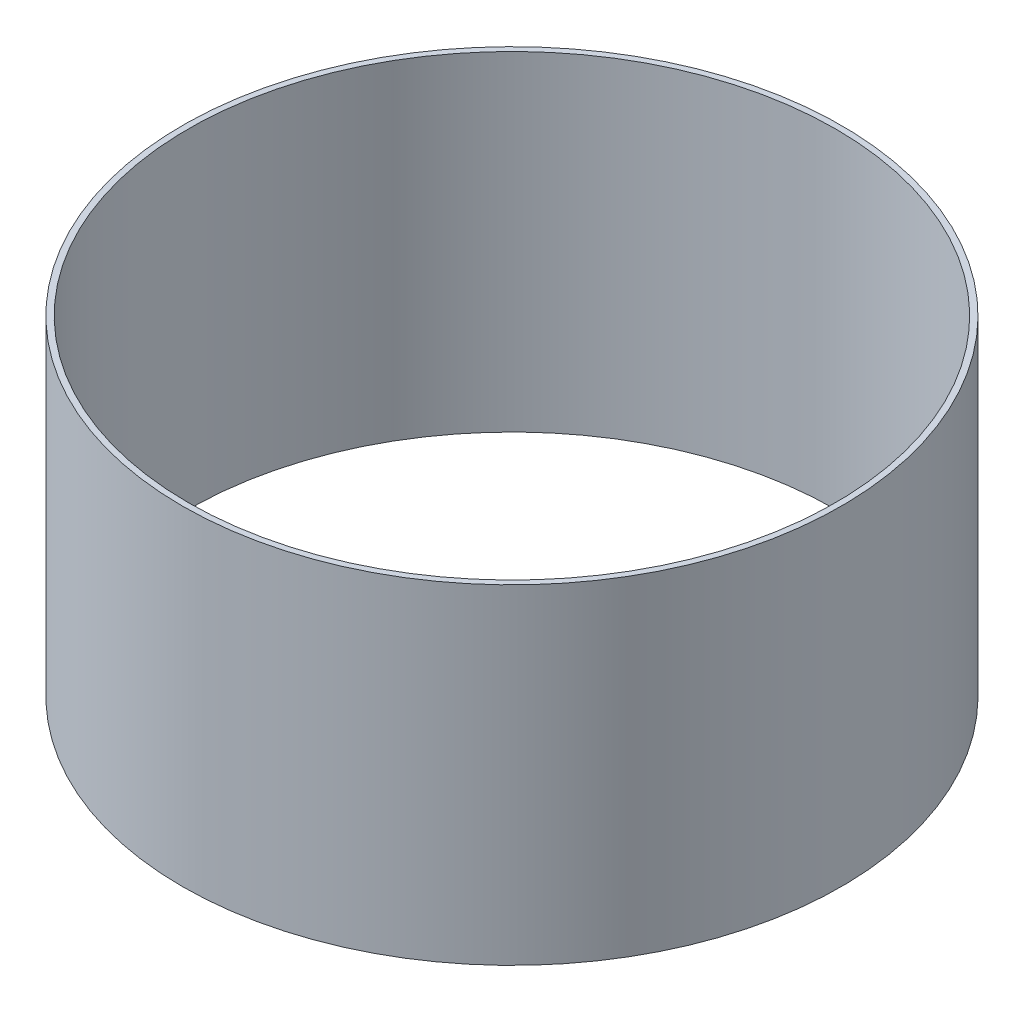
ISO-10303-21;
HEADER;
FILE_DESCRIPTION(('STEP AP214'),'2;1');
FILE_NAME('part.step','',(''),(''),'','','');
FILE_SCHEMA(('AUTOMOTIVE_DESIGN { 1 0 10303 214 1 1 1 1 }'));
ENDSEC;
DATA;
#1=APPLICATION_CONTEXT('core data for automotive mechanical design processes');
#2=APPLICATION_PROTOCOL_DEFINITION('international standard','automotive_design',2000,#1);
#3=PRODUCT_CONTEXT('',#1,'mechanical');
#4=PRODUCT('Part','Part','',(#3));
#5=PRODUCT_RELATED_PRODUCT_CATEGORY('part','',(#4));
#6=PRODUCT_DEFINITION_FORMATION('','',#4);
#7=PRODUCT_DEFINITION_CONTEXT('part definition',#1,'design');
#8=PRODUCT_DEFINITION('design','',#6,#7);
#9=PRODUCT_DEFINITION_SHAPE('','',#8);
#10=(LENGTH_UNIT() NAMED_UNIT(*) SI_UNIT(.MILLI.,.METRE.));
#11=(NAMED_UNIT(*) PLANE_ANGLE_UNIT() SI_UNIT($,.RADIAN.));
#12=(NAMED_UNIT(*) SI_UNIT($,.STERADIAN.) SOLID_ANGLE_UNIT());
#13=UNCERTAINTY_MEASURE_WITH_UNIT(LENGTH_MEASURE(1.E-05),#10,'distance_accuracy_value','');
#14=(GEOMETRIC_REPRESENTATION_CONTEXT(3) GLOBAL_UNCERTAINTY_ASSIGNED_CONTEXT((#13)) GLOBAL_UNIT_ASSIGNED_CONTEXT((#10,
#11,#12)) REPRESENTATION_CONTEXT('',''));
#15=CARTESIAN_POINT('',(0.,0.,0.));
#16=DIRECTION('',(0.,0.,1.));
#17=DIRECTION('',(1.,0.,0.));
#18=AXIS2_PLACEMENT_3D('',#15,#16,#17);
#19=CARTESIAN_POINT('',(0.,14.,0.));
#20=DIRECTION('',(0.,1.,0.));
#21=DIRECTION('',(0.,0.,1.));
#22=AXIS2_PLACEMENT_3D('',#19,#20,#21);
#23=PLANE('',#22);
#24=CARTESIAN_POINT('',(0.,14.,0.));
#25=DIRECTION('',(0.,1.,0.));
#26=DIRECTION('',(0.,0.,1.));
#27=AXIS2_PLACEMENT_3D('',#24,#25,#26);
#28=CIRCLE('',#27,14.);
#29=CARTESIAN_POINT('',(0.,14.,14.));
#30=VERTEX_POINT('',#29);
#31=EDGE_CURVE('E10',#30,#30,#28,.T.);
#32=ORIENTED_EDGE('',*,*,#31,.T.);
#33=EDGE_LOOP('',(#32));
#34=FACE_BOUND('',#33,.T.);
#35=CARTESIAN_POINT('',(0.,14.,0.));
#36=DIRECTION('',(0.,1.,0.));
#37=DIRECTION('',(0.,0.,1.));
#38=AXIS2_PLACEMENT_3D('',#35,#36,#37);
#39=CIRCLE('',#38,13.75);
#40=CARTESIAN_POINT('',(0.,14.,13.75));
#41=VERTEX_POINT('',#40);
#42=EDGE_CURVE('E54',#41,#41,#39,.T.);
#43=ORIENTED_EDGE('',*,*,#42,.F.);
#44=EDGE_LOOP('',(#43));
#45=FACE_BOUND('',#44,.T.);
#46=ADVANCED_FACE('F41',(#34,#45),#23,.T.);
#47=CARTESIAN_POINT('',(0.,0.,0.));
#48=DIRECTION('',(0.,1.,0.));
#49=DIRECTION('',(0.,0.,1.));
#50=AXIS2_PLACEMENT_3D('',#47,#48,#49);
#51=PLANE('',#50);
#52=CARTESIAN_POINT('',(0.,0.,0.));
#53=DIRECTION('',(0.,1.,0.));
#54=DIRECTION('',(0.,0.,1.));
#55=AXIS2_PLACEMENT_3D('',#52,#53,#54);
#56=CIRCLE('',#55,14.);
#57=CARTESIAN_POINT('',(0.,0.,14.));
#58=VERTEX_POINT('',#57);
#59=EDGE_CURVE('E45',#58,#58,#56,.T.);
#60=ORIENTED_EDGE('',*,*,#59,.F.);
#61=EDGE_LOOP('',(#60));
#62=FACE_BOUND('',#61,.T.);
#63=CARTESIAN_POINT('',(0.,0.,0.));
#64=DIRECTION('',(0.,1.,0.));
#65=DIRECTION('',(0.,0.,1.));
#66=AXIS2_PLACEMENT_3D('',#63,#64,#65);
#67=CIRCLE('',#66,13.75);
#68=CARTESIAN_POINT('',(0.,0.,13.75));
#69=VERTEX_POINT('',#68);
#70=EDGE_CURVE('E56',#69,#69,#67,.T.);
#71=ORIENTED_EDGE('',*,*,#70,.T.);
#72=EDGE_LOOP('',(#71));
#73=FACE_BOUND('',#72,.T.);
#74=ADVANCED_FACE('F68',(#62,#73),#51,.F.);
#75=CARTESIAN_POINT('',(0.,14.,0.));
#76=DIRECTION('',(0.,-1.,0.));
#77=DIRECTION('',(0.,0.,-1.));
#78=AXIS2_PLACEMENT_3D('',#75,#76,#77);
#79=CYLINDRICAL_SURFACE('',#78,14.);
#80=ORIENTED_EDGE('',*,*,#31,.F.);
#81=EDGE_LOOP('',(#80));
#82=FACE_BOUND('',#81,.T.);
#83=ORIENTED_EDGE('',*,*,#59,.T.);
#84=EDGE_LOOP('',(#83));
#85=FACE_BOUND('',#84,.T.);
#86=ADVANCED_FACE('F43',(#82,#85),#79,.T.);
#87=CARTESIAN_POINT('',(0.,14.,0.));
#88=DIRECTION('',(0.,-1.,0.));
#89=DIRECTION('',(0.,0.,-1.));
#90=AXIS2_PLACEMENT_3D('',#87,#88,#89);
#91=CYLINDRICAL_SURFACE('',#90,13.75);
#92=ORIENTED_EDGE('',*,*,#42,.T.);
#93=EDGE_LOOP('',(#92));
#94=FACE_BOUND('',#93,.T.);
#95=ORIENTED_EDGE('',*,*,#70,.F.);
#96=EDGE_LOOP('',(#95));
#97=FACE_BOUND('',#96,.T.);
#98=ADVANCED_FACE('F64',(#94,#97),#91,.F.);
#99=CLOSED_SHELL('',(#46,#74,#86,#98));
#100=MANIFOLD_SOLID_BREP('B2',#99);
#101=ADVANCED_BREP_SHAPE_REPRESENTATION('',(#18,#100),#14);
#102=SHAPE_DEFINITION_REPRESENTATION(#9,#101);
ENDSEC;
END-ISO-10303-21;
